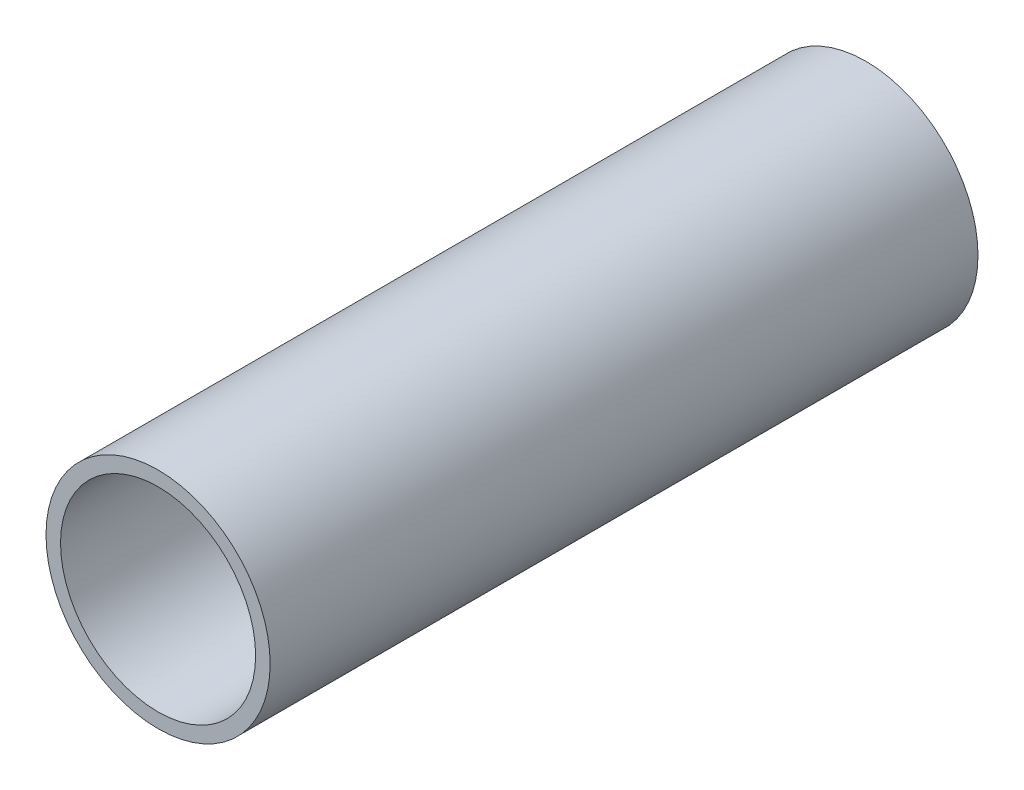
ISO-10303-21;
HEADER;
FILE_DESCRIPTION(('STEP AP214'),'2;1');
FILE_NAME('part.step','',(''),(''),'','','');
FILE_SCHEMA(('AUTOMOTIVE_DESIGN { 1 0 10303 214 1 1 1 1 }'));
ENDSEC;
DATA;
#1=APPLICATION_CONTEXT('core data for automotive mechanical design processes');
#2=APPLICATION_PROTOCOL_DEFINITION('international standard','automotive_design',2000,#1);
#3=PRODUCT_CONTEXT('',#1,'mechanical');
#4=PRODUCT('Part','Part','',(#3));
#5=PRODUCT_RELATED_PRODUCT_CATEGORY('part','',(#4));
#6=PRODUCT_DEFINITION_FORMATION('','',#4);
#7=PRODUCT_DEFINITION_CONTEXT('part definition',#1,'design');
#8=PRODUCT_DEFINITION('design','',#6,#7);
#9=PRODUCT_DEFINITION_SHAPE('','',#8);
#10=(LENGTH_UNIT() NAMED_UNIT(*) SI_UNIT(.MILLI.,.METRE.));
#11=(NAMED_UNIT(*) PLANE_ANGLE_UNIT() SI_UNIT($,.RADIAN.));
#12=(NAMED_UNIT(*) SI_UNIT($,.STERADIAN.) SOLID_ANGLE_UNIT());
#13=UNCERTAINTY_MEASURE_WITH_UNIT(LENGTH_MEASURE(1.E-05),#10,'distance_accuracy_value','');
#14=(GEOMETRIC_REPRESENTATION_CONTEXT(3) GLOBAL_UNCERTAINTY_ASSIGNED_CONTEXT((#13)) GLOBAL_UNIT_ASSIGNED_CONTEXT((#10,
#11,#12)) REPRESENTATION_CONTEXT('',''));
#15=CARTESIAN_POINT('',(0.,0.,0.));
#16=DIRECTION('',(0.,0.,1.));
#17=DIRECTION('',(1.,0.,0.));
#18=AXIS2_PLACEMENT_3D('',#15,#16,#17);
#19=CARTESIAN_POINT('',(0.,0.,190.5));
#20=DIRECTION('',(0.,0.,1.));
#21=DIRECTION('',(1.,0.,0.));
#22=AXIS2_PLACEMENT_3D('',#19,#20,#21);
#23=PLANE('',#22);
#24=CARTESIAN_POINT('',(0.,0.,190.5));
#25=DIRECTION('',(0.,0.,1.));
#26=DIRECTION('',(1.,0.,0.));
#27=AXIS2_PLACEMENT_3D('',#24,#25,#26);
#28=CIRCLE('',#27,30.1625);
#29=CARTESIAN_POINT('',(30.1625,0.,190.5));
#30=VERTEX_POINT('',#29);
#31=EDGE_CURVE('E10',#30,#30,#28,.T.);
#32=ORIENTED_EDGE('',*,*,#31,.T.);
#33=EDGE_LOOP('',(#32));
#34=FACE_BOUND('',#33,.T.);
#35=CARTESIAN_POINT('',(0.,0.,190.5));
#36=DIRECTION('',(0.,0.,1.));
#37=DIRECTION('',(1.,0.,0.));
#38=AXIS2_PLACEMENT_3D('',#35,#36,#37);
#39=CIRCLE('',#38,26.2509);
#40=CARTESIAN_POINT('',(26.2509,0.,190.5));
#41=VERTEX_POINT('',#40);
#42=EDGE_CURVE('E54',#41,#41,#39,.T.);
#43=ORIENTED_EDGE('',*,*,#42,.F.);
#44=EDGE_LOOP('',(#43));
#45=FACE_BOUND('',#44,.T.);
#46=ADVANCED_FACE('F41',(#34,#45),#23,.T.);
#47=CARTESIAN_POINT('',(0.,0.,0.));
#48=DIRECTION('',(0.,0.,1.));
#49=DIRECTION('',(1.,0.,0.));
#50=AXIS2_PLACEMENT_3D('',#47,#48,#49);
#51=PLANE('',#50);
#52=CARTESIAN_POINT('',(0.,0.,0.));
#53=DIRECTION('',(0.,0.,1.));
#54=DIRECTION('',(1.,0.,0.));
#55=AXIS2_PLACEMENT_3D('',#52,#53,#54);
#56=CIRCLE('',#55,30.1625);
#57=CARTESIAN_POINT('',(30.1625,0.,0.));
#58=VERTEX_POINT('',#57);
#59=EDGE_CURVE('E45',#58,#58,#56,.T.);
#60=ORIENTED_EDGE('',*,*,#59,.F.);
#61=EDGE_LOOP('',(#60));
#62=FACE_BOUND('',#61,.T.);
#63=CARTESIAN_POINT('',(0.,0.,0.));
#64=DIRECTION('',(0.,0.,1.));
#65=DIRECTION('',(1.,0.,0.));
#66=AXIS2_PLACEMENT_3D('',#63,#64,#65);
#67=CIRCLE('',#66,26.2509);
#68=CARTESIAN_POINT('',(26.2509,0.,0.));
#69=VERTEX_POINT('',#68);
#70=EDGE_CURVE('E56',#69,#69,#67,.T.);
#71=ORIENTED_EDGE('',*,*,#70,.T.);
#72=EDGE_LOOP('',(#71));
#73=FACE_BOUND('',#72,.T.);
#74=ADVANCED_FACE('F68',(#62,#73),#51,.F.);
#75=CARTESIAN_POINT('',(0.,0.,190.5));
#76=DIRECTION('',(0.,0.,-1.));
#77=DIRECTION('',(-1.,0.,0.));
#78=AXIS2_PLACEMENT_3D('',#75,#76,#77);
#79=CYLINDRICAL_SURFACE('',#78,30.1625);
#80=ORIENTED_EDGE('',*,*,#31,.F.);
#81=EDGE_LOOP('',(#80));
#82=FACE_BOUND('',#81,.T.);
#83=ORIENTED_EDGE('',*,*,#59,.T.);
#84=EDGE_LOOP('',(#83));
#85=FACE_BOUND('',#84,.T.);
#86=ADVANCED_FACE('F43',(#82,#85),#79,.T.);
#87=CARTESIAN_POINT('',(0.,0.,190.5));
#88=DIRECTION('',(0.,0.,-1.));
#89=DIRECTION('',(-1.,0.,0.));
#90=AXIS2_PLACEMENT_3D('',#87,#88,#89);
#91=CYLINDRICAL_SURFACE('',#90,26.2509);
#92=ORIENTED_EDGE('',*,*,#42,.T.);
#93=EDGE_LOOP('',(#92));
#94=FACE_BOUND('',#93,.T.);
#95=ORIENTED_EDGE('',*,*,#70,.F.);
#96=EDGE_LOOP('',(#95));
#97=FACE_BOUND('',#96,.T.);
#98=ADVANCED_FACE('F64',(#94,#97),#91,.F.);
#99=CLOSED_SHELL('',(#46,#74,#86,#98));
#100=MANIFOLD_SOLID_BREP('B2',#99);
#101=ADVANCED_BREP_SHAPE_REPRESENTATION('',(#18,#100),#14);
#102=SHAPE_DEFINITION_REPRESENTATION(#9,#101);
ENDSEC;
END-ISO-10303-21;
